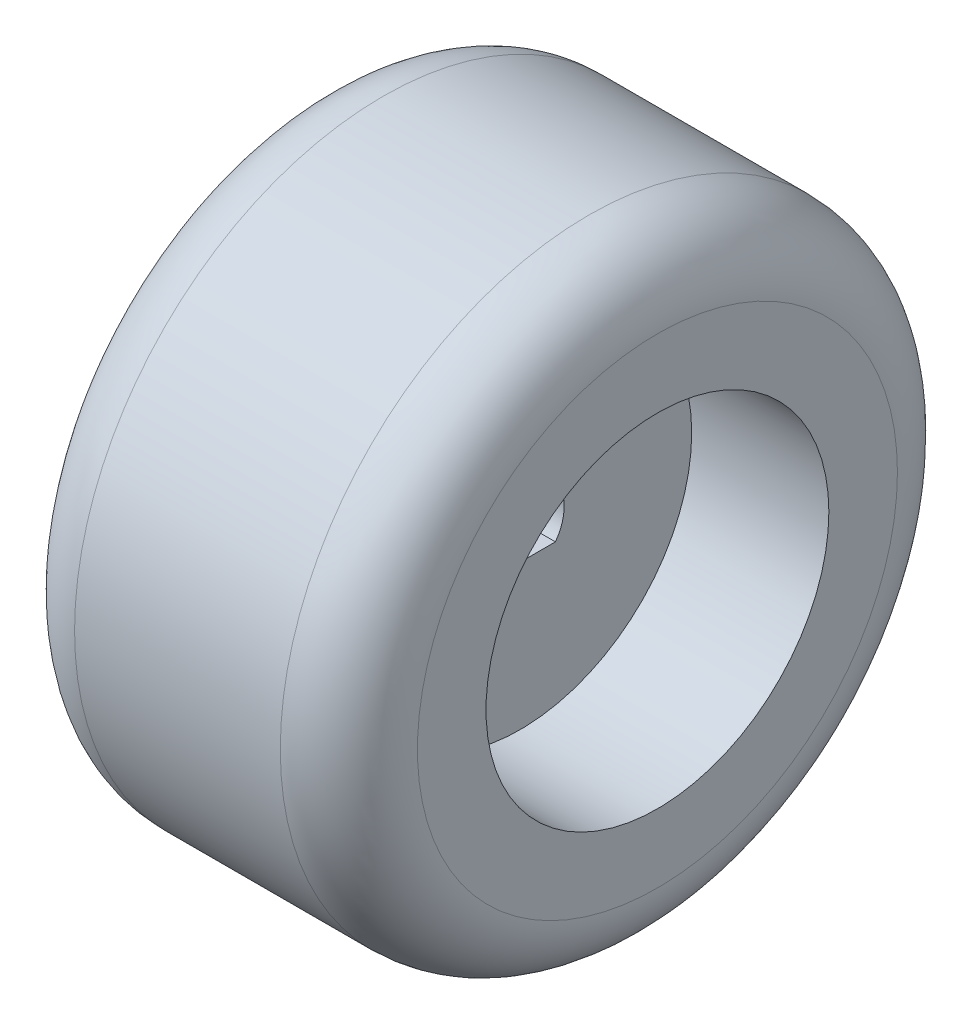
ISO-10303-21;
HEADER;
FILE_DESCRIPTION(('STEP AP214'),'2;1');
FILE_NAME('part.step','',(''),(''),'','','');
FILE_SCHEMA(('AUTOMOTIVE_DESIGN { 1 0 10303 214 1 1 1 1 }'));
ENDSEC;
DATA;
#1=APPLICATION_CONTEXT('core data for automotive mechanical design processes');
#2=APPLICATION_PROTOCOL_DEFINITION('international standard','automotive_design',2000,#1);
#3=PRODUCT_CONTEXT('',#1,'mechanical');
#4=PRODUCT('Part','Part','',(#3));
#5=PRODUCT_RELATED_PRODUCT_CATEGORY('part','',(#4));
#6=PRODUCT_DEFINITION_FORMATION('','',#4);
#7=PRODUCT_DEFINITION_CONTEXT('part definition',#1,'design');
#8=PRODUCT_DEFINITION('design','',#6,#7);
#9=PRODUCT_DEFINITION_SHAPE('','',#8);
#10=(LENGTH_UNIT() NAMED_UNIT(*) SI_UNIT(.MILLI.,.METRE.));
#11=(NAMED_UNIT(*) PLANE_ANGLE_UNIT() SI_UNIT($,.RADIAN.));
#12=(NAMED_UNIT(*) SI_UNIT($,.STERADIAN.) SOLID_ANGLE_UNIT());
#13=UNCERTAINTY_MEASURE_WITH_UNIT(LENGTH_MEASURE(1.E-05),#10,'distance_accuracy_value','');
#14=(GEOMETRIC_REPRESENTATION_CONTEXT(3) GLOBAL_UNCERTAINTY_ASSIGNED_CONTEXT((#13)) GLOBAL_UNIT_ASSIGNED_CONTEXT((#10,
#11,#12)) REPRESENTATION_CONTEXT('',''));
#15=CARTESIAN_POINT('',(0.,0.,0.));
#16=DIRECTION('',(0.,0.,1.));
#17=DIRECTION('',(1.,0.,0.));
#18=AXIS2_PLACEMENT_3D('',#15,#16,#17);
#19=CARTESIAN_POINT('',(25.,0.,0.));
#20=DIRECTION('',(-1.,0.,0.));
#21=DIRECTION('',(0.,0.,1.));
#22=AXIS2_PLACEMENT_3D('',#19,#20,#21);
#23=CYLINDRICAL_SURFACE('',#22,22.5);
#24=CARTESIAN_POINT('',(5.,0.,0.));
#25=DIRECTION('',(1.,0.,0.));
#26=DIRECTION('',(0.,0.,-1.));
#27=AXIS2_PLACEMENT_3D('',#24,#25,#26);
#28=CIRCLE('',#27,22.5);
#29=CARTESIAN_POINT('',(5.,0.,-22.5));
#30=VERTEX_POINT('',#29);
#31=EDGE_CURVE('E109',#30,#30,#28,.T.);
#32=ORIENTED_EDGE('',*,*,#31,.T.);
#33=EDGE_LOOP('',(#32));
#34=FACE_BOUND('',#33,.T.);
#35=CARTESIAN_POINT('',(20.,0.,0.));
#36=DIRECTION('',(1.,0.,0.));
#37=DIRECTION('',(0.,0.,-1.));
#38=AXIS2_PLACEMENT_3D('',#35,#36,#37);
#39=CIRCLE('',#38,22.5);
#40=CARTESIAN_POINT('',(20.,0.,-22.5));
#41=VERTEX_POINT('',#40);
#42=EDGE_CURVE('E104',#41,#41,#39,.F.);
#43=ORIENTED_EDGE('',*,*,#42,.T.);
#44=EDGE_LOOP('',(#43));
#45=FACE_BOUND('',#44,.T.);
#46=ADVANCED_FACE('F32',(#34,#45),#23,.T.);
#47=CARTESIAN_POINT('',(25.,0.,0.));
#48=DIRECTION('',(1.,0.,0.));
#49=DIRECTION('',(0.,0.,-1.));
#50=AXIS2_PLACEMENT_3D('',#47,#48,#49);
#51=PLANE('',#50);
#52=CARTESIAN_POINT('',(25.,0.,0.));
#53=DIRECTION('',(1.,0.,0.));
#54=DIRECTION('',(0.,0.,-1.));
#55=AXIS2_PLACEMENT_3D('',#52,#53,#54);
#56=CIRCLE('',#55,17.5);
#57=CARTESIAN_POINT('',(25.,0.,-17.5));
#58=VERTEX_POINT('',#57);
#59=EDGE_CURVE('E115',#58,#58,#56,.T.);
#60=ORIENTED_EDGE('',*,*,#59,.T.);
#61=EDGE_LOOP('',(#60));
#62=FACE_BOUND('',#61,.T.);
#63=CARTESIAN_POINT('',(25.,0.,0.));
#64=DIRECTION('',(1.,0.,0.));
#65=DIRECTION('',(0.,0.,-1.));
#66=AXIS2_PLACEMENT_3D('',#63,#64,#65);
#67=CIRCLE('',#66,12.5);
#68=CARTESIAN_POINT('',(25.,0.,-12.5));
#69=VERTEX_POINT('',#68);
#70=EDGE_CURVE('E98',#69,#69,#67,.T.);
#71=ORIENTED_EDGE('',*,*,#70,.F.);
#72=EDGE_LOOP('',(#71));
#73=FACE_BOUND('',#72,.T.);
#74=ADVANCED_FACE('F141',(#62,#73),#51,.T.);
#75=CARTESIAN_POINT('',(0.,0.,0.));
#76=DIRECTION('',(1.,0.,0.));
#77=DIRECTION('',(0.,0.,-1.));
#78=AXIS2_PLACEMENT_3D('',#75,#76,#77);
#79=PLANE('',#78);
#80=DIRECTION('',(0.,0.,1.));
#81=VECTOR('',#80,1.);
#82=CARTESIAN_POINT('',(0.,-1.92,-2.56));
#83=LINE('',#82,#81);
#84=CARTESIAN_POINT('',(0.,-1.92,-2.56));
#85=VERTEX_POINT('',#84);
#86=CARTESIAN_POINT('',(0.,-1.92,2.56));
#87=VERTEX_POINT('',#86);
#88=EDGE_CURVE('E84',#85,#87,#83,.T.);
#89=ORIENTED_EDGE('',*,*,#88,.F.);
#90=CARTESIAN_POINT('',(0.,0.,0.));
#91=DIRECTION('',(-1.,0.,0.));
#92=DIRECTION('',(0.,0.,1.));
#93=AXIS2_PLACEMENT_3D('',#90,#91,#92);
#94=CIRCLE('',#93,3.2);
#95=CARTESIAN_POINT('',(0.,1.92,-2.56));
#96=VERTEX_POINT('',#95);
#97=EDGE_CURVE('E47',#96,#85,#94,.T.);
#98=ORIENTED_EDGE('',*,*,#97,.F.);
#99=DIRECTION('',(0.,0.,-1.));
#100=VECTOR('',#99,1.);
#101=CARTESIAN_POINT('',(0.,1.92,2.56));
#102=LINE('',#101,#100);
#103=CARTESIAN_POINT('',(0.,1.92,2.56));
#104=VERTEX_POINT('',#103);
#105=EDGE_CURVE('E91',#104,#96,#102,.T.);
#106=ORIENTED_EDGE('',*,*,#105,.F.);
#107=CARTESIAN_POINT('',(0.,0.,0.));
#108=DIRECTION('',(-1.,0.,0.));
#109=DIRECTION('',(0.,0.,1.));
#110=AXIS2_PLACEMENT_3D('',#107,#108,#109);
#111=CIRCLE('',#110,3.2);
#112=EDGE_CURVE('E75',#87,#104,#111,.T.);
#113=ORIENTED_EDGE('',*,*,#112,.F.);
#114=EDGE_LOOP('',(#89,#98,#106,#113));
#115=FACE_BOUND('',#114,.T.);
#116=CARTESIAN_POINT('',(0.,0.,0.));
#117=DIRECTION('',(1.,0.,0.));
#118=DIRECTION('',(0.,0.,-1.));
#119=AXIS2_PLACEMENT_3D('',#116,#117,#118);
#120=CIRCLE('',#119,17.5);
#121=CARTESIAN_POINT('',(0.,0.,-17.5));
#122=VERTEX_POINT('',#121);
#123=EDGE_CURVE('E112',#122,#122,#120,.F.);
#124=ORIENTED_EDGE('',*,*,#123,.T.);
#125=EDGE_LOOP('',(#124));
#126=FACE_BOUND('',#125,.T.);
#127=ADVANCED_FACE('F88',(#115,#126),#79,.F.);
#128=CARTESIAN_POINT('',(15.,0.,0.));
#129=DIRECTION('',(1.,0.,0.));
#130=DIRECTION('',(0.,0.,-1.));
#131=AXIS2_PLACEMENT_3D('',#128,#129,#130);
#132=CYLINDRICAL_SURFACE('',#131,12.5);
#133=CARTESIAN_POINT('',(15.,0.,0.));
#134=DIRECTION('',(1.,0.,0.));
#135=DIRECTION('',(0.,0.,-1.));
#136=AXIS2_PLACEMENT_3D('',#133,#134,#135);
#137=CIRCLE('',#136,12.5);
#138=CARTESIAN_POINT('',(15.,0.,-12.5));
#139=VERTEX_POINT('',#138);
#140=EDGE_CURVE('E101',#139,#139,#137,.T.);
#141=ORIENTED_EDGE('',*,*,#140,.F.);
#142=EDGE_LOOP('',(#141));
#143=FACE_BOUND('',#142,.T.);
#144=ORIENTED_EDGE('',*,*,#70,.T.);
#145=EDGE_LOOP('',(#144));
#146=FACE_BOUND('',#145,.T.);
#147=ADVANCED_FACE('F156',(#143,#146),#132,.F.);
#148=CARTESIAN_POINT('',(15.,0.,0.));
#149=DIRECTION('',(1.,0.,0.));
#150=DIRECTION('',(0.,0.,-1.));
#151=AXIS2_PLACEMENT_3D('',#148,#149,#150);
#152=PLANE('',#151);
#153=CARTESIAN_POINT('',(15.,0.,0.));
#154=DIRECTION('',(1.,0.,0.));
#155=DIRECTION('',(0.,0.,-1.));
#156=AXIS2_PLACEMENT_3D('',#153,#154,#155);
#157=CIRCLE('',#156,3.2);
#158=CARTESIAN_POINT('',(15.,-1.92,-2.56));
#159=VERTEX_POINT('',#158);
#160=CARTESIAN_POINT('',(15.,1.92,-2.56));
#161=VERTEX_POINT('',#160);
#162=EDGE_CURVE('E11',#159,#161,#157,.T.);
#163=ORIENTED_EDGE('',*,*,#162,.F.);
#164=DIRECTION('',(0.,0.,-1.));
#165=VECTOR('',#164,1.);
#166=CARTESIAN_POINT('',(15.,-1.92,0.));
#167=LINE('',#166,#165);
#168=CARTESIAN_POINT('',(15.,-1.92,2.56));
#169=VERTEX_POINT('',#168);
#170=EDGE_CURVE('E118',#169,#159,#167,.T.);
#171=ORIENTED_EDGE('',*,*,#170,.F.);
#172=CARTESIAN_POINT('',(15.,0.,0.));
#173=DIRECTION('',(1.,0.,0.));
#174=DIRECTION('',(0.,0.,-1.));
#175=AXIS2_PLACEMENT_3D('',#172,#173,#174);
#176=CIRCLE('',#175,3.2);
#177=CARTESIAN_POINT('',(15.,1.92,2.56));
#178=VERTEX_POINT('',#177);
#179=EDGE_CURVE('E78',#178,#169,#176,.T.);
#180=ORIENTED_EDGE('',*,*,#179,.F.);
#181=DIRECTION('',(0.,0.,1.));
#182=VECTOR('',#181,1.);
#183=CARTESIAN_POINT('',(15.,1.92,0.));
#184=LINE('',#183,#182);
#185=EDGE_CURVE('E40',#161,#178,#184,.T.);
#186=ORIENTED_EDGE('',*,*,#185,.F.);
#187=EDGE_LOOP('',(#163,#171,#180,#186));
#188=FACE_BOUND('',#187,.T.);
#189=ORIENTED_EDGE('',*,*,#140,.T.);
#190=EDGE_LOOP('',(#189));
#191=FACE_BOUND('',#190,.T.);
#192=ADVANCED_FACE('F126',(#188,#191),#152,.T.);
#193=CARTESIAN_POINT('',(5.,0.,0.));
#194=DIRECTION('',(1.,0.,0.));
#195=DIRECTION('',(0.,0.,-1.));
#196=AXIS2_PLACEMENT_3D('',#193,#194,#195);
#197=TOROIDAL_SURFACE('',#196,17.5,5.);
#198=ORIENTED_EDGE('',*,*,#123,.F.);
#199=EDGE_LOOP('',(#198));
#200=FACE_BOUND('',#199,.T.);
#201=ORIENTED_EDGE('',*,*,#31,.F.);
#202=EDGE_LOOP('',(#201));
#203=FACE_BOUND('',#202,.T.);
#204=ADVANCED_FACE('F136',(#200,#203),#197,.T.);
#205=CARTESIAN_POINT('',(20.,0.,0.));
#206=DIRECTION('',(1.,0.,0.));
#207=DIRECTION('',(0.,0.,-1.));
#208=AXIS2_PLACEMENT_3D('',#205,#206,#207);
#209=TOROIDAL_SURFACE('',#208,17.5,5.);
#210=ORIENTED_EDGE('',*,*,#42,.F.);
#211=EDGE_LOOP('',(#210));
#212=FACE_BOUND('',#211,.T.);
#213=ORIENTED_EDGE('',*,*,#59,.F.);
#214=EDGE_LOOP('',(#213));
#215=FACE_BOUND('',#214,.T.);
#216=ADVANCED_FACE('F34',(#212,#215),#209,.T.);
#217=CARTESIAN_POINT('',(25.,0.,0.));
#218=DIRECTION('',(-1.,0.,0.));
#219=DIRECTION('',(0.,0.,1.));
#220=AXIS2_PLACEMENT_3D('',#217,#218,#219);
#221=CYLINDRICAL_SURFACE('',#220,3.2);
#222=ORIENTED_EDGE('',*,*,#162,.T.);
#223=DIRECTION('',(-1.,0.,0.));
#224=VECTOR('',#223,1.);
#225=CARTESIAN_POINT('',(25.,1.92,-2.56));
#226=LINE('',#225,#224);
#227=EDGE_CURVE('E96',#161,#96,#226,.T.);
#228=ORIENTED_EDGE('',*,*,#227,.T.);
#229=ORIENTED_EDGE('',*,*,#97,.T.);
#230=DIRECTION('',(-1.,0.,0.));
#231=VECTOR('',#230,1.);
#232=CARTESIAN_POINT('',(25.,-1.92,-2.56));
#233=LINE('',#232,#231);
#234=EDGE_CURVE('E81',#159,#85,#233,.T.);
#235=ORIENTED_EDGE('',*,*,#234,.F.);
#236=EDGE_LOOP('',(#222,#228,#229,#235));
#237=FACE_BOUND('',#236,.T.);
#238=ADVANCED_FACE('F128',(#237),#221,.F.);
#239=CARTESIAN_POINT('',(25.,1.92,2.56));
#240=DIRECTION('',(0.,1.,0.));
#241=DIRECTION('',(0.,0.,1.));
#242=AXIS2_PLACEMENT_3D('',#239,#240,#241);
#243=PLANE('',#242);
#244=ORIENTED_EDGE('',*,*,#185,.T.);
#245=DIRECTION('',(-1.,0.,0.));
#246=VECTOR('',#245,1.);
#247=CARTESIAN_POINT('',(25.,1.92,2.56));
#248=LINE('',#247,#246);
#249=EDGE_CURVE('E80',#178,#104,#248,.T.);
#250=ORIENTED_EDGE('',*,*,#249,.T.);
#251=ORIENTED_EDGE('',*,*,#105,.T.);
#252=ORIENTED_EDGE('',*,*,#227,.F.);
#253=EDGE_LOOP('',(#244,#250,#251,#252));
#254=FACE_BOUND('',#253,.T.);
#255=ADVANCED_FACE('F123',(#254),#243,.F.);
#256=CARTESIAN_POINT('',(25.,0.,0.));
#257=DIRECTION('',(-1.,0.,0.));
#258=DIRECTION('',(0.,0.,1.));
#259=AXIS2_PLACEMENT_3D('',#256,#257,#258);
#260=CYLINDRICAL_SURFACE('',#259,3.2);
#261=ORIENTED_EDGE('',*,*,#179,.T.);
#262=DIRECTION('',(-1.,0.,0.));
#263=VECTOR('',#262,1.);
#264=CARTESIAN_POINT('',(25.,-1.92,2.56));
#265=LINE('',#264,#263);
#266=EDGE_CURVE('E55',#169,#87,#265,.T.);
#267=ORIENTED_EDGE('',*,*,#266,.T.);
#268=ORIENTED_EDGE('',*,*,#112,.T.);
#269=ORIENTED_EDGE('',*,*,#249,.F.);
#270=EDGE_LOOP('',(#261,#267,#268,#269));
#271=FACE_BOUND('',#270,.T.);
#272=ADVANCED_FACE('F72',(#271),#260,.F.);
#273=CARTESIAN_POINT('',(25.,-1.92,-2.56));
#274=DIRECTION('',(0.,-1.,0.));
#275=DIRECTION('',(0.,0.,-1.));
#276=AXIS2_PLACEMENT_3D('',#273,#274,#275);
#277=PLANE('',#276);
#278=ORIENTED_EDGE('',*,*,#170,.T.);
#279=ORIENTED_EDGE('',*,*,#234,.T.);
#280=ORIENTED_EDGE('',*,*,#88,.T.);
#281=ORIENTED_EDGE('',*,*,#266,.F.);
#282=EDGE_LOOP('',(#278,#279,#280,#281));
#283=FACE_BOUND('',#282,.T.);
#284=ADVANCED_FACE('F85',(#283),#277,.F.);
#285=CLOSED_SHELL('',(#46,#74,#127,#147,#192,#204,#216,#238,#255,#272,#284));
#286=MANIFOLD_SOLID_BREP('B2',#285);
#287=ADVANCED_BREP_SHAPE_REPRESENTATION('',(#18,#286),#14);
#288=SHAPE_DEFINITION_REPRESENTATION(#9,#287);
ENDSEC;
END-ISO-10303-21;
